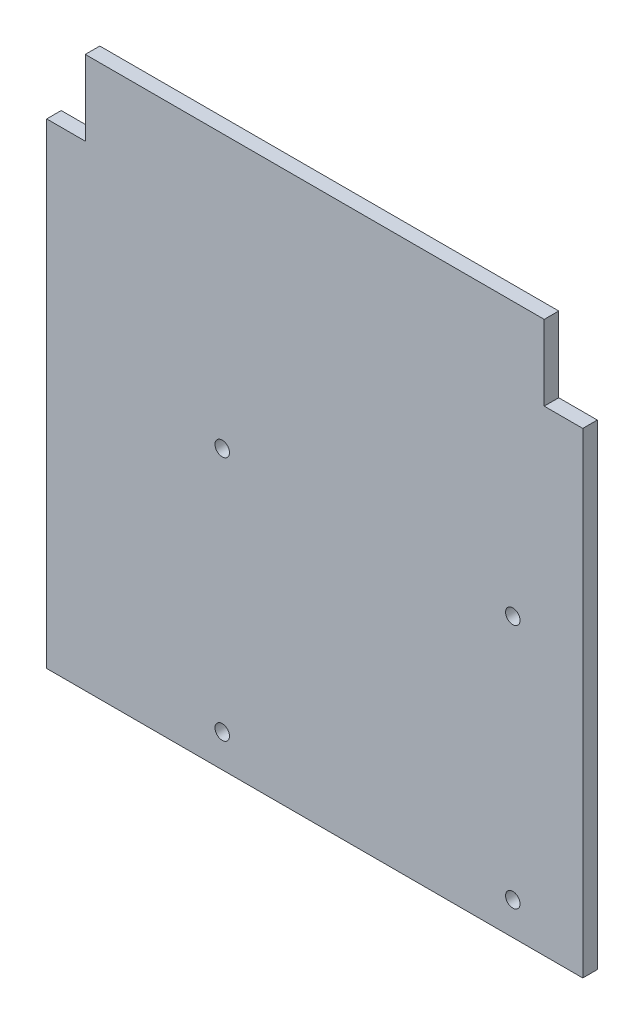
ISO-10303-21;
HEADER;
FILE_DESCRIPTION(('STEP AP214'),'2;1');
FILE_NAME('part.step','',(''),(''),'','','');
FILE_SCHEMA(('AUTOMOTIVE_DESIGN { 1 0 10303 214 1 1 1 1 }'));
ENDSEC;
DATA;
#1=APPLICATION_CONTEXT('core data for automotive mechanical design processes');
#2=APPLICATION_PROTOCOL_DEFINITION('international standard','automotive_design',2000,#1);
#3=PRODUCT_CONTEXT('',#1,'mechanical');
#4=PRODUCT('Part','Part','',(#3));
#5=PRODUCT_RELATED_PRODUCT_CATEGORY('part','',(#4));
#6=PRODUCT_DEFINITION_FORMATION('','',#4);
#7=PRODUCT_DEFINITION_CONTEXT('part definition',#1,'design');
#8=PRODUCT_DEFINITION('design','',#6,#7);
#9=PRODUCT_DEFINITION_SHAPE('','',#8);
#10=(LENGTH_UNIT() NAMED_UNIT(*) SI_UNIT(.MILLI.,.METRE.));
#11=(NAMED_UNIT(*) PLANE_ANGLE_UNIT() SI_UNIT($,.RADIAN.));
#12=(NAMED_UNIT(*) SI_UNIT($,.STERADIAN.) SOLID_ANGLE_UNIT());
#13=UNCERTAINTY_MEASURE_WITH_UNIT(LENGTH_MEASURE(1.E-05),#10,'distance_accuracy_value','');
#14=(GEOMETRIC_REPRESENTATION_CONTEXT(3) GLOBAL_UNCERTAINTY_ASSIGNED_CONTEXT((#13)) GLOBAL_UNIT_ASSIGNED_CONTEXT((#10,
#11,#12)) REPRESENTATION_CONTEXT('',''));
#15=CARTESIAN_POINT('',(0.,0.,0.));
#16=DIRECTION('',(0.,0.,1.));
#17=DIRECTION('',(1.,0.,0.));
#18=AXIS2_PLACEMENT_3D('',#15,#16,#17);
#19=CARTESIAN_POINT('',(0.,0.,2.9));
#20=DIRECTION('',(0.,0.,1.));
#21=DIRECTION('',(1.,0.,0.));
#22=AXIS2_PLACEMENT_3D('',#19,#20,#21);
#23=PLANE('',#22);
#24=CARTESIAN_POINT('',(39.5367463577164,8.04772718496975,2.9));
#25=DIRECTION('',(0.,0.,1.));
#26=DIRECTION('',(1.,0.,0.));
#27=AXIS2_PLACEMENT_3D('',#24,#25,#26);
#28=CIRCLE('',#27,1.45);
#29=CARTESIAN_POINT('',(40.9867463577164,8.04772718496975,2.9));
#30=VERTEX_POINT('',#29);
#31=EDGE_CURVE('E221',#30,#30,#28,.T.);
#32=ORIENTED_EDGE('',*,*,#31,.F.);
#33=EDGE_LOOP('',(#32));
#34=FACE_BOUND('',#33,.T.);
#35=CARTESIAN_POINT('',(-18.4632536422836,8.04772718496975,2.9));
#36=DIRECTION('',(0.,0.,1.));
#37=DIRECTION('',(1.,0.,0.));
#38=AXIS2_PLACEMENT_3D('',#35,#36,#37);
#39=CIRCLE('',#38,1.45);
#40=CARTESIAN_POINT('',(-17.0132536422836,8.04772718496975,2.9));
#41=VERTEX_POINT('',#40);
#42=EDGE_CURVE('E146',#41,#41,#39,.T.);
#43=ORIENTED_EDGE('',*,*,#42,.F.);
#44=EDGE_LOOP('',(#43));
#45=FACE_BOUND('',#44,.T.);
#46=DIRECTION('',(-1.,0.,0.));
#47=VECTOR('',#46,1.);
#48=CARTESIAN_POINT('',(45.8019525887963,47.5,2.9));
#49=LINE('',#48,#47);
#50=CARTESIAN_POINT('',(53.5,47.5,2.9));
#51=VERTEX_POINT('',#50);
#52=CARTESIAN_POINT('',(45.8019525887963,47.5,2.9));
#53=VERTEX_POINT('',#52);
#54=EDGE_CURVE('E164',#51,#53,#49,.T.);
#55=ORIENTED_EDGE('',*,*,#54,.T.);
#56=DIRECTION('',(0.,1.,0.));
#57=VECTOR('',#56,1.);
#58=CARTESIAN_POINT('',(45.8019525887963,47.5,2.9));
#59=LINE('',#58,#57);
#60=CARTESIAN_POINT('',(45.8019525887963,62.5,2.9));
#61=VERTEX_POINT('',#60);
#62=EDGE_CURVE('E100',#53,#61,#59,.T.);
#63=ORIENTED_EDGE('',*,*,#62,.T.);
#64=DIRECTION('',(-1.,0.,0.));
#65=VECTOR('',#64,1.);
#66=CARTESIAN_POINT('',(45.8019525887963,62.5,2.9));
#67=LINE('',#66,#65);
#68=CARTESIAN_POINT('',(-45.8019525887963,62.5,2.9));
#69=VERTEX_POINT('',#68);
#70=EDGE_CURVE('E185',#61,#69,#67,.T.);
#71=ORIENTED_EDGE('',*,*,#70,.T.);
#72=DIRECTION('',(0.,-1.,0.));
#73=VECTOR('',#72,1.);
#74=CARTESIAN_POINT('',(-45.8019525887963,47.5,2.9));
#75=LINE('',#74,#73);
#76=CARTESIAN_POINT('',(-45.8019525887963,47.5,2.9));
#77=VERTEX_POINT('',#76);
#78=EDGE_CURVE('E199',#69,#77,#75,.T.);
#79=ORIENTED_EDGE('',*,*,#78,.T.);
#80=DIRECTION('',(-1.,0.,0.));
#81=VECTOR('',#80,1.);
#82=CARTESIAN_POINT('',(-53.5,47.5,2.9));
#83=LINE('',#82,#81);
#84=CARTESIAN_POINT('',(-53.5,47.5,2.9));
#85=VERTEX_POINT('',#84);
#86=EDGE_CURVE('E119',#77,#85,#83,.T.);
#87=ORIENTED_EDGE('',*,*,#86,.T.);
#88=DIRECTION('',(0.,-1.,0.));
#89=VECTOR('',#88,1.);
#90=CARTESIAN_POINT('',(-53.5,-47.5,2.9));
#91=LINE('',#90,#89);
#92=CARTESIAN_POINT('',(-53.5,-47.5,2.9));
#93=VERTEX_POINT('',#92);
#94=EDGE_CURVE('E113',#85,#93,#91,.T.);
#95=ORIENTED_EDGE('',*,*,#94,.T.);
#96=DIRECTION('',(1.,0.,0.));
#97=VECTOR('',#96,1.);
#98=CARTESIAN_POINT('',(-53.5,-47.5,2.9));
#99=LINE('',#98,#97);
#100=CARTESIAN_POINT('',(53.5,-47.5,2.9));
#101=VERTEX_POINT('',#100);
#102=EDGE_CURVE('E117',#93,#101,#99,.T.);
#103=ORIENTED_EDGE('',*,*,#102,.T.);
#104=DIRECTION('',(0.,1.,0.));
#105=VECTOR('',#104,1.);
#106=CARTESIAN_POINT('',(53.5,-47.5,2.9));
#107=LINE('',#106,#105);
#108=EDGE_CURVE('E57',#101,#51,#107,.T.);
#109=ORIENTED_EDGE('',*,*,#108,.T.);
#110=EDGE_LOOP('',(#55,#63,#71,#79,#87,#95,#103,#109));
#111=FACE_BOUND('',#110,.T.);
#112=CARTESIAN_POINT('',(39.5367463577164,-40.9522728150302,2.9));
#113=DIRECTION('',(0.,0.,1.));
#114=DIRECTION('',(1.,0.,0.));
#115=AXIS2_PLACEMENT_3D('',#112,#113,#114);
#116=CIRCLE('',#115,1.44999999999999);
#117=CARTESIAN_POINT('',(40.9867463577164,-40.9522728150302,2.9));
#118=VERTEX_POINT('',#117);
#119=EDGE_CURVE('E213',#118,#118,#116,.T.);
#120=ORIENTED_EDGE('',*,*,#119,.F.);
#121=EDGE_LOOP('',(#120));
#122=FACE_BOUND('',#121,.T.);
#123=CARTESIAN_POINT('',(-18.4632536422836,-40.9522728150303,2.9));
#124=DIRECTION('',(0.,0.,1.));
#125=DIRECTION('',(1.,0.,0.));
#126=AXIS2_PLACEMENT_3D('',#123,#124,#125);
#127=CIRCLE('',#126,1.44999999999999);
#128=CARTESIAN_POINT('',(-17.0132536422836,-40.9522728150303,2.9));
#129=VERTEX_POINT('',#128);
#130=EDGE_CURVE('E229',#129,#129,#127,.T.);
#131=ORIENTED_EDGE('',*,*,#130,.F.);
#132=EDGE_LOOP('',(#131));
#133=FACE_BOUND('',#132,.T.);
#134=ADVANCED_FACE('F39',(#34,#45,#111,#122,#133),#23,.T.);
#135=CARTESIAN_POINT('',(0.,0.,0.));
#136=DIRECTION('',(0.,0.,1.));
#137=DIRECTION('',(1.,0.,0.));
#138=AXIS2_PLACEMENT_3D('',#135,#136,#137);
#139=PLANE('',#138);
#140=DIRECTION('',(-1.,0.,0.));
#141=VECTOR('',#140,1.);
#142=CARTESIAN_POINT('',(45.8019525887963,47.5,0.));
#143=LINE('',#142,#141);
#144=CARTESIAN_POINT('',(53.5,47.5,0.));
#145=VERTEX_POINT('',#144);
#146=CARTESIAN_POINT('',(45.8019525887963,47.5,0.));
#147=VERTEX_POINT('',#146);
#148=EDGE_CURVE('E141',#145,#147,#143,.T.);
#149=ORIENTED_EDGE('',*,*,#148,.F.);
#150=DIRECTION('',(0.,1.,0.));
#151=VECTOR('',#150,1.);
#152=CARTESIAN_POINT('',(53.5,-47.5,0.));
#153=LINE('',#152,#151);
#154=CARTESIAN_POINT('',(53.5,-47.5,0.));
#155=VERTEX_POINT('',#154);
#156=EDGE_CURVE('E92',#155,#145,#153,.T.);
#157=ORIENTED_EDGE('',*,*,#156,.F.);
#158=DIRECTION('',(1.,0.,0.));
#159=VECTOR('',#158,1.);
#160=CARTESIAN_POINT('',(-53.5,-47.5,0.));
#161=LINE('',#160,#159);
#162=CARTESIAN_POINT('',(-53.5,-47.5,0.));
#163=VERTEX_POINT('',#162);
#164=EDGE_CURVE('E86',#163,#155,#161,.T.);
#165=ORIENTED_EDGE('',*,*,#164,.F.);
#166=DIRECTION('',(0.,-1.,0.));
#167=VECTOR('',#166,1.);
#168=CARTESIAN_POINT('',(-53.5,-47.5,0.));
#169=LINE('',#168,#167);
#170=CARTESIAN_POINT('',(-53.5,47.5,0.));
#171=VERTEX_POINT('',#170);
#172=EDGE_CURVE('E128',#171,#163,#169,.T.);
#173=ORIENTED_EDGE('',*,*,#172,.F.);
#174=DIRECTION('',(-1.,0.,0.));
#175=VECTOR('',#174,1.);
#176=CARTESIAN_POINT('',(-53.5,47.5,0.));
#177=LINE('',#176,#175);
#178=CARTESIAN_POINT('',(-45.8019525887963,47.5,0.));
#179=VERTEX_POINT('',#178);
#180=EDGE_CURVE('E155',#179,#171,#177,.T.);
#181=ORIENTED_EDGE('',*,*,#180,.F.);
#182=DIRECTION('',(0.,-1.,0.));
#183=VECTOR('',#182,1.);
#184=CARTESIAN_POINT('',(-45.8019525887963,47.5,0.));
#185=LINE('',#184,#183);
#186=CARTESIAN_POINT('',(-45.8019525887963,62.5,0.));
#187=VERTEX_POINT('',#186);
#188=EDGE_CURVE('E152',#187,#179,#185,.T.);
#189=ORIENTED_EDGE('',*,*,#188,.F.);
#190=DIRECTION('',(-1.,0.,0.));
#191=VECTOR('',#190,1.);
#192=CARTESIAN_POINT('',(45.8019525887963,62.5,0.));
#193=LINE('',#192,#191);
#194=CARTESIAN_POINT('',(45.8019525887963,62.5,0.));
#195=VERTEX_POINT('',#194);
#196=EDGE_CURVE('E149',#195,#187,#193,.T.);
#197=ORIENTED_EDGE('',*,*,#196,.F.);
#198=DIRECTION('',(0.,1.,0.));
#199=VECTOR('',#198,1.);
#200=CARTESIAN_POINT('',(45.8019525887963,47.5,0.));
#201=LINE('',#200,#199);
#202=EDGE_CURVE('E145',#147,#195,#201,.T.);
#203=ORIENTED_EDGE('',*,*,#202,.F.);
#204=EDGE_LOOP('',(#149,#157,#165,#173,#181,#189,#197,#203));
#205=FACE_BOUND('',#204,.T.);
#206=CARTESIAN_POINT('',(-18.4632536422836,8.04772718496975,0.));
#207=DIRECTION('',(0.,0.,1.));
#208=DIRECTION('',(1.,0.,0.));
#209=AXIS2_PLACEMENT_3D('',#206,#207,#208);
#210=CIRCLE('',#209,1.45);
#211=CARTESIAN_POINT('',(-17.0132536422836,8.04772718496975,0.));
#212=VERTEX_POINT('',#211);
#213=EDGE_CURVE('E209',#212,#212,#210,.T.);
#214=ORIENTED_EDGE('',*,*,#213,.T.);
#215=EDGE_LOOP('',(#214));
#216=FACE_BOUND('',#215,.T.);
#217=CARTESIAN_POINT('',(39.5367463577164,-40.9522728150302,0.));
#218=DIRECTION('',(0.,0.,1.));
#219=DIRECTION('',(1.,0.,0.));
#220=AXIS2_PLACEMENT_3D('',#217,#218,#219);
#221=CIRCLE('',#220,1.44999999999999);
#222=CARTESIAN_POINT('',(40.9867463577164,-40.9522728150302,0.));
#223=VERTEX_POINT('',#222);
#224=EDGE_CURVE('E217',#223,#223,#221,.T.);
#225=ORIENTED_EDGE('',*,*,#224,.T.);
#226=EDGE_LOOP('',(#225));
#227=FACE_BOUND('',#226,.T.);
#228=CARTESIAN_POINT('',(39.5367463577164,8.04772718496975,0.));
#229=DIRECTION('',(0.,0.,1.));
#230=DIRECTION('',(1.,0.,0.));
#231=AXIS2_PLACEMENT_3D('',#228,#229,#230);
#232=CIRCLE('',#231,1.45);
#233=CARTESIAN_POINT('',(40.9867463577164,8.04772718496975,0.));
#234=VERTEX_POINT('',#233);
#235=EDGE_CURVE('E225',#234,#234,#232,.T.);
#236=ORIENTED_EDGE('',*,*,#235,.T.);
#237=EDGE_LOOP('',(#236));
#238=FACE_BOUND('',#237,.T.);
#239=CARTESIAN_POINT('',(-18.4632536422836,-40.9522728150303,0.));
#240=DIRECTION('',(0.,0.,1.));
#241=DIRECTION('',(1.,0.,0.));
#242=AXIS2_PLACEMENT_3D('',#239,#240,#241);
#243=CIRCLE('',#242,1.44999999999999);
#244=CARTESIAN_POINT('',(-17.0132536422836,-40.9522728150303,0.));
#245=VERTEX_POINT('',#244);
#246=EDGE_CURVE('E233',#245,#245,#243,.T.);
#247=ORIENTED_EDGE('',*,*,#246,.T.);
#248=EDGE_LOOP('',(#247));
#249=FACE_BOUND('',#248,.T.);
#250=ADVANCED_FACE('F189',(#205,#216,#227,#238,#249),#139,.F.);
#251=CARTESIAN_POINT('',(45.8019525887963,47.5,2.9));
#252=DIRECTION('',(0.,-1.,0.));
#253=DIRECTION('',(0.,0.,-1.));
#254=AXIS2_PLACEMENT_3D('',#251,#252,#253);
#255=PLANE('',#254);
#256=ORIENTED_EDGE('',*,*,#148,.T.);
#257=DIRECTION('',(0.,0.,-1.));
#258=VECTOR('',#257,1.);
#259=CARTESIAN_POINT('',(45.8019525887963,47.5,2.9));
#260=LINE('',#259,#258);
#261=EDGE_CURVE('E11',#53,#147,#260,.T.);
#262=ORIENTED_EDGE('',*,*,#261,.F.);
#263=ORIENTED_EDGE('',*,*,#54,.F.);
#264=DIRECTION('',(0.,0.,-1.));
#265=VECTOR('',#264,1.);
#266=CARTESIAN_POINT('',(53.5,47.5,2.9));
#267=LINE('',#266,#265);
#268=EDGE_CURVE('E137',#51,#145,#267,.T.);
#269=ORIENTED_EDGE('',*,*,#268,.T.);
#270=EDGE_LOOP('',(#256,#262,#263,#269));
#271=FACE_BOUND('',#270,.T.);
#272=ADVANCED_FACE('F41',(#271),#255,.F.);
#273=CARTESIAN_POINT('',(45.8019525887963,47.5,2.9));
#274=DIRECTION('',(-1.,0.,0.));
#275=DIRECTION('',(0.,-1.,0.));
#276=AXIS2_PLACEMENT_3D('',#273,#274,#275);
#277=PLANE('',#276);
#278=ORIENTED_EDGE('',*,*,#202,.T.);
#279=DIRECTION('',(0.,0.,-1.));
#280=VECTOR('',#279,1.);
#281=CARTESIAN_POINT('',(45.8019525887963,62.5,2.9));
#282=LINE('',#281,#280);
#283=EDGE_CURVE('E49',#61,#195,#282,.T.);
#284=ORIENTED_EDGE('',*,*,#283,.F.);
#285=ORIENTED_EDGE('',*,*,#62,.F.);
#286=ORIENTED_EDGE('',*,*,#261,.T.);
#287=EDGE_LOOP('',(#278,#284,#285,#286));
#288=FACE_BOUND('',#287,.T.);
#289=ADVANCED_FACE('F269',(#288),#277,.F.);
#290=CARTESIAN_POINT('',(45.8019525887963,62.5,2.9));
#291=DIRECTION('',(0.,-1.,0.));
#292=DIRECTION('',(1.,0.,0.));
#293=AXIS2_PLACEMENT_3D('',#290,#291,#292);
#294=PLANE('',#293);
#295=ORIENTED_EDGE('',*,*,#196,.T.);
#296=DIRECTION('',(0.,0.,-1.));
#297=VECTOR('',#296,1.);
#298=CARTESIAN_POINT('',(-45.8019525887963,62.5,2.9));
#299=LINE('',#298,#297);
#300=EDGE_CURVE('E175',#69,#187,#299,.T.);
#301=ORIENTED_EDGE('',*,*,#300,.F.);
#302=ORIENTED_EDGE('',*,*,#70,.F.);
#303=ORIENTED_EDGE('',*,*,#283,.T.);
#304=EDGE_LOOP('',(#295,#301,#302,#303));
#305=FACE_BOUND('',#304,.T.);
#306=ADVANCED_FACE('F183',(#305),#294,.F.);
#307=CARTESIAN_POINT('',(-45.8019525887963,47.5,2.9));
#308=DIRECTION('',(1.,0.,0.));
#309=DIRECTION('',(0.,0.,-1.));
#310=AXIS2_PLACEMENT_3D('',#307,#308,#309);
#311=PLANE('',#310);
#312=ORIENTED_EDGE('',*,*,#188,.T.);
#313=DIRECTION('',(0.,0.,-1.));
#314=VECTOR('',#313,1.);
#315=CARTESIAN_POINT('',(-45.8019525887963,47.5,2.9));
#316=LINE('',#315,#314);
#317=EDGE_CURVE('E171',#77,#179,#316,.T.);
#318=ORIENTED_EDGE('',*,*,#317,.F.);
#319=ORIENTED_EDGE('',*,*,#78,.F.);
#320=ORIENTED_EDGE('',*,*,#300,.T.);
#321=EDGE_LOOP('',(#312,#318,#319,#320));
#322=FACE_BOUND('',#321,.T.);
#323=ADVANCED_FACE('F194',(#322),#311,.F.);
#324=CARTESIAN_POINT('',(-53.5,47.5,2.9));
#325=DIRECTION('',(0.,-1.,0.));
#326=DIRECTION('',(0.,0.,-1.));
#327=AXIS2_PLACEMENT_3D('',#324,#325,#326);
#328=PLANE('',#327);
#329=ORIENTED_EDGE('',*,*,#180,.T.);
#330=DIRECTION('',(0.,0.,-1.));
#331=VECTOR('',#330,1.);
#332=CARTESIAN_POINT('',(-53.5,47.5,2.9));
#333=LINE('',#332,#331);
#334=EDGE_CURVE('E130',#85,#171,#333,.T.);
#335=ORIENTED_EDGE('',*,*,#334,.F.);
#336=ORIENTED_EDGE('',*,*,#86,.F.);
#337=ORIENTED_EDGE('',*,*,#317,.T.);
#338=EDGE_LOOP('',(#329,#335,#336,#337));
#339=FACE_BOUND('',#338,.T.);
#340=ADVANCED_FACE('F197',(#339),#328,.F.);
#341=CARTESIAN_POINT('',(-53.5,-47.5,2.9));
#342=DIRECTION('',(1.,0.,0.));
#343=DIRECTION('',(0.,0.,-1.));
#344=AXIS2_PLACEMENT_3D('',#341,#342,#343);
#345=PLANE('',#344);
#346=ORIENTED_EDGE('',*,*,#172,.T.);
#347=DIRECTION('',(0.,0.,-1.));
#348=VECTOR('',#347,1.);
#349=CARTESIAN_POINT('',(-53.5,-47.5,2.9));
#350=LINE('',#349,#348);
#351=EDGE_CURVE('E125',#93,#163,#350,.T.);
#352=ORIENTED_EDGE('',*,*,#351,.F.);
#353=ORIENTED_EDGE('',*,*,#94,.F.);
#354=ORIENTED_EDGE('',*,*,#334,.T.);
#355=EDGE_LOOP('',(#346,#352,#353,#354));
#356=FACE_BOUND('',#355,.T.);
#357=ADVANCED_FACE('F126',(#356),#345,.F.);
#358=CARTESIAN_POINT('',(-53.5,-47.5,2.9));
#359=DIRECTION('',(0.,1.,0.));
#360=DIRECTION('',(0.,0.,1.));
#361=AXIS2_PLACEMENT_3D('',#358,#359,#360);
#362=PLANE('',#361);
#363=ORIENTED_EDGE('',*,*,#164,.T.);
#364=DIRECTION('',(0.,0.,-1.));
#365=VECTOR('',#364,1.);
#366=CARTESIAN_POINT('',(53.5,-47.5,2.9));
#367=LINE('',#366,#365);
#368=EDGE_CURVE('E131',#101,#155,#367,.T.);
#369=ORIENTED_EDGE('',*,*,#368,.F.);
#370=ORIENTED_EDGE('',*,*,#102,.F.);
#371=ORIENTED_EDGE('',*,*,#351,.T.);
#372=EDGE_LOOP('',(#363,#369,#370,#371));
#373=FACE_BOUND('',#372,.T.);
#374=ADVANCED_FACE('F133',(#373),#362,.F.);
#375=CARTESIAN_POINT('',(53.5,-47.5,2.9));
#376=DIRECTION('',(-1.,0.,0.));
#377=DIRECTION('',(0.,0.,1.));
#378=AXIS2_PLACEMENT_3D('',#375,#376,#377);
#379=PLANE('',#378);
#380=ORIENTED_EDGE('',*,*,#156,.T.);
#381=ORIENTED_EDGE('',*,*,#268,.F.);
#382=ORIENTED_EDGE('',*,*,#108,.F.);
#383=ORIENTED_EDGE('',*,*,#368,.T.);
#384=EDGE_LOOP('',(#380,#381,#382,#383));
#385=FACE_BOUND('',#384,.T.);
#386=ADVANCED_FACE('F257',(#385),#379,.F.);
#387=CARTESIAN_POINT('',(-18.4632536422836,8.04772718496975,2.9));
#388=DIRECTION('',(0.,0.,-1.));
#389=DIRECTION('',(-1.,0.,0.));
#390=AXIS2_PLACEMENT_3D('',#387,#388,#389);
#391=CYLINDRICAL_SURFACE('',#390,1.45);
#392=ORIENTED_EDGE('',*,*,#42,.T.);
#393=EDGE_LOOP('',(#392));
#394=FACE_BOUND('',#393,.T.);
#395=ORIENTED_EDGE('',*,*,#213,.F.);
#396=EDGE_LOOP('',(#395));
#397=FACE_BOUND('',#396,.T.);
#398=ADVANCED_FACE('F254',(#394,#397),#391,.F.);
#399=CARTESIAN_POINT('',(39.5367463577164,-40.9522728150302,2.9));
#400=DIRECTION('',(0.,0.,-1.));
#401=DIRECTION('',(-1.,0.,0.));
#402=AXIS2_PLACEMENT_3D('',#399,#400,#401);
#403=CYLINDRICAL_SURFACE('',#402,1.44999999999999);
#404=ORIENTED_EDGE('',*,*,#119,.T.);
#405=EDGE_LOOP('',(#404));
#406=FACE_BOUND('',#405,.T.);
#407=ORIENTED_EDGE('',*,*,#224,.F.);
#408=EDGE_LOOP('',(#407));
#409=FACE_BOUND('',#408,.T.);
#410=ADVANCED_FACE('F333',(#406,#409),#403,.F.);
#411=CARTESIAN_POINT('',(39.5367463577164,8.04772718496975,2.9));
#412=DIRECTION('',(0.,0.,-1.));
#413=DIRECTION('',(-1.,0.,0.));
#414=AXIS2_PLACEMENT_3D('',#411,#412,#413);
#415=CYLINDRICAL_SURFACE('',#414,1.45);
#416=ORIENTED_EDGE('',*,*,#31,.T.);
#417=EDGE_LOOP('',(#416));
#418=FACE_BOUND('',#417,.T.);
#419=ORIENTED_EDGE('',*,*,#235,.F.);
#420=EDGE_LOOP('',(#419));
#421=FACE_BOUND('',#420,.T.);
#422=ADVANCED_FACE('F341',(#418,#421),#415,.F.);
#423=CARTESIAN_POINT('',(-18.4632536422836,-40.9522728150303,2.9));
#424=DIRECTION('',(0.,0.,-1.));
#425=DIRECTION('',(-1.,0.,0.));
#426=AXIS2_PLACEMENT_3D('',#423,#424,#425);
#427=CYLINDRICAL_SURFACE('',#426,1.44999999999999);
#428=ORIENTED_EDGE('',*,*,#130,.T.);
#429=EDGE_LOOP('',(#428));
#430=FACE_BOUND('',#429,.T.);
#431=ORIENTED_EDGE('',*,*,#246,.F.);
#432=EDGE_LOOP('',(#431));
#433=FACE_BOUND('',#432,.T.);
#434=ADVANCED_FACE('F241',(#430,#433),#427,.F.);
#435=CLOSED_SHELL('',(#134,#250,#272,#289,#306,#323,#340,#357,#374,#386,#398,#410,#422,#434));
#436=MANIFOLD_SOLID_BREP('B2',#435);
#437=ADVANCED_BREP_SHAPE_REPRESENTATION('',(#18,#436),#14);
#438=SHAPE_DEFINITION_REPRESENTATION(#9,#437);
ENDSEC;
END-ISO-10303-21;
